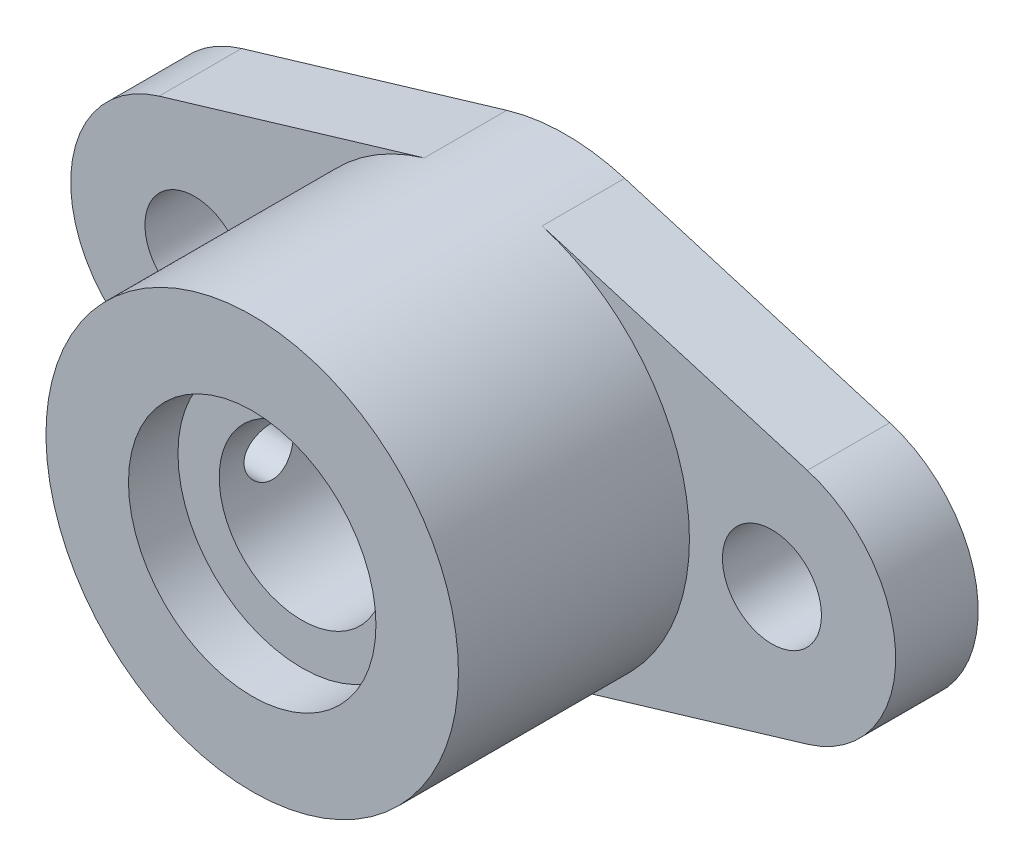
ISO-10303-21;
HEADER;
FILE_DESCRIPTION(('STEP AP214'),'2;1');
FILE_NAME('part.step','',(''),(''),'','','');
FILE_SCHEMA(('AUTOMOTIVE_DESIGN { 1 0 10303 214 1 1 1 1 }'));
ENDSEC;
DATA;
#1=APPLICATION_CONTEXT('core data for automotive mechanical design processes');
#2=APPLICATION_PROTOCOL_DEFINITION('international standard','automotive_design',2000,#1);
#3=PRODUCT_CONTEXT('',#1,'mechanical');
#4=PRODUCT('Part','Part','',(#3));
#5=PRODUCT_RELATED_PRODUCT_CATEGORY('part','',(#4));
#6=PRODUCT_DEFINITION_FORMATION('','',#4);
#7=PRODUCT_DEFINITION_CONTEXT('part definition',#1,'design');
#8=PRODUCT_DEFINITION('design','',#6,#7);
#9=PRODUCT_DEFINITION_SHAPE('','',#8);
#10=(LENGTH_UNIT() NAMED_UNIT(*) SI_UNIT(.MILLI.,.METRE.));
#11=(NAMED_UNIT(*) PLANE_ANGLE_UNIT() SI_UNIT($,.RADIAN.));
#12=(NAMED_UNIT(*) SI_UNIT($,.STERADIAN.) SOLID_ANGLE_UNIT());
#13=UNCERTAINTY_MEASURE_WITH_UNIT(LENGTH_MEASURE(1.E-05),#10,'distance_accuracy_value','');
#14=(GEOMETRIC_REPRESENTATION_CONTEXT(3) GLOBAL_UNCERTAINTY_ASSIGNED_CONTEXT((#13)) GLOBAL_UNIT_ASSIGNED_CONTEXT((#10,
#11,#12)) REPRESENTATION_CONTEXT('',''));
#15=CARTESIAN_POINT('',(0.,0.,0.));
#16=DIRECTION('',(0.,0.,1.));
#17=DIRECTION('',(1.,0.,0.));
#18=AXIS2_PLACEMENT_3D('',#15,#16,#17);
#19=CARTESIAN_POINT('',(0.,0.,38.));
#20=DIRECTION('',(0.,0.,-1.));
#21=DIRECTION('',(-1.,0.,0.));
#22=AXIS2_PLACEMENT_3D('',#19,#20,#21);
#23=CYLINDRICAL_SURFACE('',#22,25.);
#24=CARTESIAN_POINT('',(-25.,0.,29.));
#25=CARTESIAN_POINT('',(-24.9999977357459,-0.167864047107699,28.9999928360586));
#26=CARTESIAN_POINT('',(-24.9982914200408,-0.335834317331191,28.9858633413073));
#27=CARTESIAN_POINT('',(-24.991648705422,-0.667104571308249,28.9297189358446));
#28=CARTESIAN_POINT('',(-24.9867088933728,-0.830399429590068,28.8876745587494));
#29=CARTESIAN_POINT('',(-24.9741559265426,-1.14747479534053,28.776953723474));
#30=CARTESIAN_POINT('',(-24.9665445315309,-1.30126148759225,28.7082947931758));
#31=CARTESIAN_POINT('',(-24.9494959264345,-1.595099157832,28.5463312649167));
#32=CARTESIAN_POINT('',(-24.9400590404141,-1.73515256713516,28.4530310402467));
#33=CARTESIAN_POINT('',(-24.920360105442,-1.99829131534451,28.2439251380248));
#34=CARTESIAN_POINT('',(-24.9100945030904,-2.1212966913072,28.1280191598881));
#35=CARTESIAN_POINT('',(-24.8899239397152,-2.34615931038342,27.8772070351121));
#36=CARTESIAN_POINT('',(-24.8800189967068,-2.44801549826473,27.7422999409814));
#37=CARTESIAN_POINT('',(-24.8616560370405,-2.62798342873896,27.4567991747016));
#38=CARTESIAN_POINT('',(-24.8532025903971,-2.70602075672569,27.3061582754199));
#39=CARTESIAN_POINT('',(-24.8387461344686,-2.83566057301559,26.9937912978913));
#40=CARTESIAN_POINT('',(-24.8327430393798,-2.88726398696776,26.8320656080307));
#41=CARTESIAN_POINT('',(-24.8239006073737,-2.96232930045399,26.5029471406886));
#42=CARTESIAN_POINT('',(-24.8210461452543,-2.98592577987646,26.3355854715723));
#43=CARTESIAN_POINT('',(-24.8187777690611,-3.0047237521967,25.9992550636358));
#44=CARTESIAN_POINT('',(-24.8193637271033,-2.99992630052848,25.830286384783));
#45=CARTESIAN_POINT('',(-24.8238961466306,-2.96218316078668,25.4964740352156));
#46=CARTESIAN_POINT('',(-24.8278249434675,-2.92938543222302,25.3316133613198));
#47=CARTESIAN_POINT('',(-24.8385728087608,-2.83680346170066,25.0097529721786));
#48=CARTESIAN_POINT('',(-24.8453919315688,-2.77701871225814,24.852753404821));
#49=CARTESIAN_POINT('',(-24.8611722079476,-2.63199980699861,24.5506105317609));
#50=CARTESIAN_POINT('',(-24.8701387862198,-2.54670106203924,24.4054985216464));
#51=CARTESIAN_POINT('',(-24.8891993987901,-2.35312173169469,24.1315927890842));
#52=CARTESIAN_POINT('',(-24.8992934806213,-2.24484017723156,24.0027997550974));
#53=CARTESIAN_POINT('',(-24.9195503308637,-2.0075475556218,23.7643289156356));
#54=CARTESIAN_POINT('',(-24.929713127424,-1.87840890051215,23.6547780301429));
#55=CARTESIAN_POINT('',(-24.9489020798549,-1.60350795893872,23.4588884789997));
#56=CARTESIAN_POINT('',(-24.9579282334421,-1.45774563908004,23.3725498599809));
#57=CARTESIAN_POINT('',(-24.9738318861702,-1.15363930826284,23.2255367143603));
#58=CARTESIAN_POINT('',(-24.9807087472809,-0.995291578715588,23.1648698066696));
#59=CARTESIAN_POINT('',(-24.991533065309,-0.670556022273438,23.0710212621491));
#60=CARTESIAN_POINT('',(-24.9954806485584,-0.504168542441621,23.0378384399955));
#61=CARTESIAN_POINT('',(-24.9999852500304,-0.169174396374215,23.0000637445023));
#62=CARTESIAN_POINT('',(-25.0005630093753,-0.000587720432050821,22.9952969675993));
#63=CARTESIAN_POINT('',(-24.9983187823231,0.334982068243261,23.0140285778683));
#64=CARTESIAN_POINT('',(-24.9954968625308,0.50196521232733,23.0375264112954));
#65=CARTESIAN_POINT('',(-24.9867833380686,0.829074263928357,23.1119749640031));
#66=CARTESIAN_POINT('',(-24.9809010237909,0.989219346369035,23.1628426130501));
#67=CARTESIAN_POINT('',(-24.9667255501792,1.29870539768646,23.2905007033536));
#68=CARTESIAN_POINT('',(-24.9584323148759,1.44804602592347,23.3672919614901));
#69=CARTESIAN_POINT('',(-24.9403085158695,1.73246717766504,23.5450429159024));
#70=CARTESIAN_POINT('',(-24.9304708084643,1.86747628962751,23.6461161378108));
#71=CARTESIAN_POINT('',(-24.9103817919419,2.11867625152203,23.8694008464082));
#72=CARTESIAN_POINT('',(-24.9001304677484,2.23486641472949,23.991613104148));
#73=CARTESIAN_POINT('',(-24.8803059484942,2.44574795226153,24.2544756154277));
#74=CARTESIAN_POINT('',(-24.8707365831307,2.54032363231939,24.3952190153439));
#75=CARTESIAN_POINT('',(-24.8534214993383,2.70449314429332,24.6906950250756));
#76=CARTESIAN_POINT('',(-24.8456757467943,2.77408744356074,24.8454273731182));
#77=CARTESIAN_POINT('',(-24.8329105734502,2.88612996668159,25.1641106088947));
#78=CARTESIAN_POINT('',(-24.8278845275633,2.92864420159346,25.3280380118594));
#79=CARTESIAN_POINT('',(-24.8211085274587,2.98553272163516,25.6607689694851));
#80=CARTESIAN_POINT('',(-24.8193584337106,2.99990820526081,25.8295723161573));
#81=CARTESIAN_POINT('',(-24.819336326607,3.0000903381793,26.1661127296372));
#82=CARTESIAN_POINT('',(-24.8210421863943,2.9860787367135,26.3338497257713));
#83=CARTESIAN_POINT('',(-24.8276922947425,2.93026848672089,26.6645667863942));
#84=CARTESIAN_POINT('',(-24.8326365444656,2.88846982822067,26.8275468491756));
#85=CARTESIAN_POINT('',(-24.8451996524586,2.77832739820545,27.1441045388887));
#86=CARTESIAN_POINT('',(-24.8528177016812,2.70999165570539,27.2976849934955));
#87=CARTESIAN_POINT('',(-24.8698714539139,2.54873282628009,27.5912277470701));
#88=CARTESIAN_POINT('',(-24.8793071726153,2.45580952709445,27.7311899284593));
#89=CARTESIAN_POINT('',(-24.8990055122588,2.24733689647205,27.9944529401088));
#90=CARTESIAN_POINT('',(-24.9092728581347,2.1316520393015,28.1176461032663));
#91=CARTESIAN_POINT('',(-24.9294354968169,1.88122093334447,28.342942479566));
#92=CARTESIAN_POINT('',(-24.939330701051,1.74647018263601,28.4450406976292));
#93=CARTESIAN_POINT('',(-24.9576721709324,1.46119322465137,28.6255505779989));
#94=CARTESIAN_POINT('',(-24.966113221621,1.31061323462417,28.7038777257223));
#95=CARTESIAN_POINT('',(-24.9805418519727,0.998422751685309,28.8340237644426));
#96=CARTESIAN_POINT('',(-24.9865321180615,0.836824564362142,28.8858716961804));
#97=CARTESIAN_POINT('',(-24.9939268325999,0.561977101236696,28.9490634203381));
#98=CARTESIAN_POINT('',(-24.996193279433,0.450466569753487,28.9681374838864));
#99=CARTESIAN_POINT('',(-24.9992306204204,0.225986735693695,28.993608143491));
#100=CARTESIAN_POINT('',(-25.0000015244492,0.113017442753626,29.0000048232504));
#101=CARTESIAN_POINT('',(-25.,0.,29.));
#102=B_SPLINE_CURVE_WITH_KNOTS('',3,(#24,#25,#26,#27,#28,#29,#30,#31,#32,#33,#34,#35,#36,#37,
#38,#39,#40,#41,#42,#43,#44,#45,#46,#47,#48,#49,#50,#51,#52,#53,#54,#55,#56,#57,#58,#59,#60,#61,
#62,#63,#64,#65,#66,#67,#68,#69,#70,#71,#72,#73,#74,#75,#76,#77,#78,#79,#80,#81,#82,#83,#84,#85,
#86,#87,#88,#89,#90,#91,#92,#93,#94,#95,#96,#97,#98,#99,#100,#101),.UNSPECIFIED.,.T.,.F.,(4,2,2,
2,2,2,2,2,2,2,2,2,2,2,2,2,2,2,2,2,2,2,2,2,2,2,2,2,2,2,2,2,2,2,2,2,2,2,4),(0.,0.50317935095616,
1.00689069408623,1.5102708637556,2.01356175441693,2.51913872195878,3.02474090904883,
3.53190689496397,4.03905511999113,4.54375638343278,5.04843888668479,5.55047092912253,
6.05251241253396,6.55583573710536,7.05918028869262,7.56572944640317,8.07227962172601,
8.57898002694278,9.08565857822619,9.58921522624225,10.0927620090108,10.5947890255775,
11.0968318630167,11.6012692178556,12.1057249760356,12.6128207581672,13.119907053063,
13.6257524826489,14.1315763666154,14.6341719319229,15.1367676776234,15.6392114771388,
16.1416596143121,16.6471952402032,17.1528504352009,17.6602829023946,18.1671576479275,
18.5059342945627,18.8447087043981),.UNSPECIFIED.);
#103=CARTESIAN_POINT('',(-25.,0.,29.));
#104=VERTEX_POINT('',#103);
#105=EDGE_CURVE('E253',#104,#104,#102,.T.);
#106=ORIENTED_EDGE('',*,*,#105,.T.);
#107=EDGE_LOOP('',(#106));
#108=FACE_BOUND('',#107,.T.);
#109=CARTESIAN_POINT('',(0.,0.,38.));
#110=DIRECTION('',(0.,0.,1.));
#111=DIRECTION('',(1.,0.,0.));
#112=AXIS2_PLACEMENT_3D('',#109,#110,#111);
#113=CIRCLE('',#112,25.);
#114=CARTESIAN_POINT('',(25.,0.,38.));
#115=VERTEX_POINT('',#114);
#116=EDGE_CURVE('E146',#115,#115,#113,.T.);
#117=ORIENTED_EDGE('',*,*,#116,.F.);
#118=EDGE_LOOP('',(#117));
#119=FACE_BOUND('',#118,.T.);
#120=DIRECTION('',(0.,0.,-1.));
#121=VECTOR('',#120,1.);
#122=CARTESIAN_POINT('',(7.14285714285714,-23.9578711874977,10.));
#123=LINE('',#122,#121);
#124=CARTESIAN_POINT('',(7.14285714285714,-23.9578711874977,10.));
#125=VERTEX_POINT('',#124);
#126=CARTESIAN_POINT('',(7.14285714285715,-23.9578711874977,0.));
#127=VERTEX_POINT('',#126);
#128=EDGE_CURVE('E68',#125,#127,#123,.T.);
#129=ORIENTED_EDGE('',*,*,#128,.F.);
#130=CARTESIAN_POINT('',(0.,0.,10.));
#131=DIRECTION('',(0.,0.,1.));
#132=DIRECTION('',(1.,0.,0.));
#133=AXIS2_PLACEMENT_3D('',#130,#131,#132);
#134=CIRCLE('',#133,25.);
#135=CARTESIAN_POINT('',(7.14285714285715,23.9578711874977,10.));
#136=VERTEX_POINT('',#135);
#137=EDGE_CURVE('E63',#125,#136,#134,.T.);
#138=ORIENTED_EDGE('',*,*,#137,.T.);
#139=DIRECTION('',(0.,0.,-1.));
#140=VECTOR('',#139,1.);
#141=CARTESIAN_POINT('',(7.14285714285714,23.9578711874977,10.));
#142=LINE('',#141,#140);
#143=CARTESIAN_POINT('',(7.14285714285714,23.9578711874977,0.));
#144=VERTEX_POINT('',#143);
#145=EDGE_CURVE('E142',#136,#144,#142,.T.);
#146=ORIENTED_EDGE('',*,*,#145,.T.);
#147=CARTESIAN_POINT('',(0.,0.,0.));
#148=DIRECTION('',(0.,0.,1.));
#149=DIRECTION('',(1.,0.,0.));
#150=AXIS2_PLACEMENT_3D('',#147,#148,#149);
#151=CIRCLE('',#150,25.);
#152=CARTESIAN_POINT('',(-7.14285714285714,23.9578711874977,0.));
#153=VERTEX_POINT('',#152);
#154=EDGE_CURVE('E136',#144,#153,#151,.T.);
#155=ORIENTED_EDGE('',*,*,#154,.T.);
#156=DIRECTION('',(0.,0.,-1.));
#157=VECTOR('',#156,1.);
#158=CARTESIAN_POINT('',(-7.14285714285715,23.9578711874977,10.));
#159=LINE('',#158,#157);
#160=CARTESIAN_POINT('',(-7.14285714285714,23.9578711874977,10.));
#161=VERTEX_POINT('',#160);
#162=EDGE_CURVE('E172',#161,#153,#159,.T.);
#163=ORIENTED_EDGE('',*,*,#162,.F.);
#164=CARTESIAN_POINT('',(0.,0.,10.));
#165=DIRECTION('',(0.,0.,1.));
#166=DIRECTION('',(1.,0.,0.));
#167=AXIS2_PLACEMENT_3D('',#164,#165,#166);
#168=CIRCLE('',#167,25.);
#169=CARTESIAN_POINT('',(-7.14285714285714,-23.9578711874977,10.));
#170=VERTEX_POINT('',#169);
#171=EDGE_CURVE('E169',#161,#170,#168,.T.);
#172=ORIENTED_EDGE('',*,*,#171,.T.);
#173=DIRECTION('',(0.,0.,-1.));
#174=VECTOR('',#173,1.);
#175=CARTESIAN_POINT('',(-7.14285714285714,-23.9578711874977,10.));
#176=LINE('',#175,#174);
#177=CARTESIAN_POINT('',(-7.14285714285714,-23.9578711874977,0.));
#178=VERTEX_POINT('',#177);
#179=EDGE_CURVE('E190',#170,#178,#176,.T.);
#180=ORIENTED_EDGE('',*,*,#179,.T.);
#181=EDGE_CURVE('E140',#178,#127,#151,.T.);
#182=ORIENTED_EDGE('',*,*,#181,.T.);
#183=EDGE_LOOP('',(#129,#138,#146,#155,#163,#172,#180,#182));
#184=FACE_BOUND('',#183,.T.);
#185=ADVANCED_FACE('F41',(#108,#119,#184),#23,.T.);
#186=CARTESIAN_POINT('',(-7.14285714285714,23.9578711874977,10.));
#187=DIRECTION('',(-0.285714285714286,0.95831484749991,0.));
#188=DIRECTION('',(-0.95831484749991,-0.285714285714286,0.));
#189=AXIS2_PLACEMENT_3D('',#186,#187,#188);
#190=PLANE('',#189);
#191=DIRECTION('',(0.95831484749991,0.285714285714286,0.));
#192=VECTOR('',#191,1.);
#193=CARTESIAN_POINT('',(-7.14285714285714,23.9578711874977,0.));
#194=LINE('',#193,#192);
#195=CARTESIAN_POINT('',(-39.2857142857143,14.3747227124986,0.));
#196=VERTEX_POINT('',#195);
#197=EDGE_CURVE('E176',#196,#153,#194,.T.);
#198=ORIENTED_EDGE('',*,*,#197,.F.);
#199=DIRECTION('',(0.,0.,-1.));
#200=VECTOR('',#199,1.);
#201=CARTESIAN_POINT('',(-39.2857142857143,14.3747227124986,10.));
#202=LINE('',#201,#200);
#203=CARTESIAN_POINT('',(-39.2857142857143,14.3747227124986,10.));
#204=VERTEX_POINT('',#203);
#205=EDGE_CURVE('E11',#204,#196,#202,.T.);
#206=ORIENTED_EDGE('',*,*,#205,.F.);
#207=DIRECTION('',(0.95831484749991,0.285714285714286,0.));
#208=VECTOR('',#207,1.);
#209=CARTESIAN_POINT('',(-7.14285714285714,23.9578711874977,10.));
#210=LINE('',#209,#208);
#211=EDGE_CURVE('E156',#204,#161,#210,.T.);
#212=ORIENTED_EDGE('',*,*,#211,.T.);
#213=ORIENTED_EDGE('',*,*,#162,.T.);
#214=EDGE_LOOP('',(#198,#206,#212,#213));
#215=FACE_BOUND('',#214,.T.);
#216=ADVANCED_FACE('F209',(#215),#190,.T.);
#217=CARTESIAN_POINT('',(-35.,0.,10.));
#218=DIRECTION('',(0.,0.,-1.));
#219=DIRECTION('',(-1.,0.,0.));
#220=AXIS2_PLACEMENT_3D('',#217,#218,#219);
#221=CYLINDRICAL_SURFACE('',#220,15.);
#222=CARTESIAN_POINT('',(-35.,0.,0.));
#223=DIRECTION('',(0.,0.,1.));
#224=DIRECTION('',(1.,0.,0.));
#225=AXIS2_PLACEMENT_3D('',#222,#223,#224);
#226=CIRCLE('',#225,15.);
#227=CARTESIAN_POINT('',(-39.2857142857143,-14.3747227124986,0.));
#228=VERTEX_POINT('',#227);
#229=EDGE_CURVE('E180',#196,#228,#226,.T.);
#230=ORIENTED_EDGE('',*,*,#229,.T.);
#231=DIRECTION('',(0.,0.,-1.));
#232=VECTOR('',#231,1.);
#233=CARTESIAN_POINT('',(-39.2857142857143,-14.3747227124986,10.));
#234=LINE('',#233,#232);
#235=CARTESIAN_POINT('',(-39.2857142857143,-14.3747227124986,10.));
#236=VERTEX_POINT('',#235);
#237=EDGE_CURVE('E56',#236,#228,#234,.T.);
#238=ORIENTED_EDGE('',*,*,#237,.F.);
#239=CARTESIAN_POINT('',(-35.,0.,10.));
#240=DIRECTION('',(0.,0.,1.));
#241=DIRECTION('',(1.,0.,0.));
#242=AXIS2_PLACEMENT_3D('',#239,#240,#241);
#243=CIRCLE('',#242,15.);
#244=EDGE_CURVE('E161',#204,#236,#243,.T.);
#245=ORIENTED_EDGE('',*,*,#244,.F.);
#246=ORIENTED_EDGE('',*,*,#205,.T.);
#247=EDGE_LOOP('',(#230,#238,#245,#246));
#248=FACE_BOUND('',#247,.T.);
#249=ADVANCED_FACE('F203',(#248),#221,.T.);
#250=CARTESIAN_POINT('',(-7.14285714285714,-23.9578711874977,10.));
#251=DIRECTION('',(0.285714285714286,0.95831484749991,0.));
#252=DIRECTION('',(-0.95831484749991,0.285714285714286,0.));
#253=AXIS2_PLACEMENT_3D('',#250,#251,#252);
#254=PLANE('',#253);
#255=DIRECTION('',(0.95831484749991,-0.285714285714286,0.));
#256=VECTOR('',#255,1.);
#257=CARTESIAN_POINT('',(-7.14285714285714,-23.9578711874977,0.));
#258=LINE('',#257,#256);
#259=EDGE_CURVE('E157',#228,#178,#258,.T.);
#260=ORIENTED_EDGE('',*,*,#259,.T.);
#261=ORIENTED_EDGE('',*,*,#179,.F.);
#262=DIRECTION('',(0.95831484749991,-0.285714285714286,0.));
#263=VECTOR('',#262,1.);
#264=CARTESIAN_POINT('',(-7.14285714285714,-23.9578711874977,10.));
#265=LINE('',#264,#263);
#266=EDGE_CURVE('E165',#236,#170,#265,.T.);
#267=ORIENTED_EDGE('',*,*,#266,.F.);
#268=ORIENTED_EDGE('',*,*,#237,.T.);
#269=EDGE_LOOP('',(#260,#261,#267,#268));
#270=FACE_BOUND('',#269,.T.);
#271=ADVANCED_FACE('F198',(#270),#254,.F.);
#272=CARTESIAN_POINT('',(-35.,0.,10.));
#273=DIRECTION('',(0.,0.,-1.));
#274=DIRECTION('',(-1.,0.,0.));
#275=AXIS2_PLACEMENT_3D('',#272,#273,#274);
#276=CYLINDRICAL_SURFACE('',#275,5.99999999999999);
#277=CARTESIAN_POINT('',(-35.,0.,10.));
#278=DIRECTION('',(0.,0.,1.));
#279=DIRECTION('',(1.,0.,0.));
#280=AXIS2_PLACEMENT_3D('',#277,#278,#279);
#281=CIRCLE('',#280,5.99999999999999);
#282=CARTESIAN_POINT('',(-29.,0.,10.));
#283=VERTEX_POINT('',#282);
#284=EDGE_CURVE('E152',#283,#283,#281,.T.);
#285=ORIENTED_EDGE('',*,*,#284,.T.);
#286=EDGE_LOOP('',(#285));
#287=FACE_BOUND('',#286,.T.);
#288=CARTESIAN_POINT('',(-35.,0.,0.));
#289=DIRECTION('',(0.,0.,1.));
#290=DIRECTION('',(1.,0.,0.));
#291=AXIS2_PLACEMENT_3D('',#288,#289,#290);
#292=CIRCLE('',#291,5.99999999999999);
#293=CARTESIAN_POINT('',(-29.,0.,0.));
#294=VERTEX_POINT('',#293);
#295=EDGE_CURVE('E149',#294,#294,#292,.T.);
#296=ORIENTED_EDGE('',*,*,#295,.F.);
#297=EDGE_LOOP('',(#296));
#298=FACE_BOUND('',#297,.T.);
#299=ADVANCED_FACE('F43',(#287,#298),#276,.F.);
#300=CARTESIAN_POINT('',(0.,0.,10.));
#301=DIRECTION('',(0.,0.,1.));
#302=DIRECTION('',(1.,0.,0.));
#303=AXIS2_PLACEMENT_3D('',#300,#301,#302);
#304=PLANE('',#303);
#305=ORIENTED_EDGE('',*,*,#284,.F.);
#306=EDGE_LOOP('',(#305));
#307=FACE_BOUND('',#306,.T.);
#308=ORIENTED_EDGE('',*,*,#211,.F.);
#309=ORIENTED_EDGE('',*,*,#244,.T.);
#310=ORIENTED_EDGE('',*,*,#266,.T.);
#311=ORIENTED_EDGE('',*,*,#171,.F.);
#312=EDGE_LOOP('',(#308,#309,#310,#311));
#313=FACE_BOUND('',#312,.T.);
#314=ADVANCED_FACE('F284',(#307,#313),#304,.T.);
#315=CARTESIAN_POINT('',(0.,0.,0.));
#316=DIRECTION('',(0.,0.,1.));
#317=DIRECTION('',(1.,0.,0.));
#318=AXIS2_PLACEMENT_3D('',#315,#316,#317);
#319=PLANE('',#318);
#320=CARTESIAN_POINT('',(0.,0.,0.));
#321=DIRECTION('',(0.,0.,1.));
#322=DIRECTION('',(1.,0.,0.));
#323=AXIS2_PLACEMENT_3D('',#320,#321,#322);
#324=CIRCLE('',#323,9.99999999999999);
#325=CARTESIAN_POINT('',(9.99999999999999,0.,0.));
#326=VERTEX_POINT('',#325);
#327=EDGE_CURVE('E236',#326,#326,#324,.T.);
#328=ORIENTED_EDGE('',*,*,#327,.T.);
#329=EDGE_LOOP('',(#328));
#330=FACE_BOUND('',#329,.T.);
#331=ORIENTED_EDGE('',*,*,#295,.T.);
#332=EDGE_LOOP('',(#331));
#333=FACE_BOUND('',#332,.T.);
#334=ORIENTED_EDGE('',*,*,#197,.T.);
#335=ORIENTED_EDGE('',*,*,#154,.F.);
#336=DIRECTION('',(0.95831484749991,-0.285714285714286,0.));
#337=VECTOR('',#336,1.);
#338=CARTESIAN_POINT('',(7.14285714285715,23.9578711874977,0.));
#339=LINE('',#338,#337);
#340=CARTESIAN_POINT('',(39.2857142857143,14.3747227124986,0.));
#341=VERTEX_POINT('',#340);
#342=EDGE_CURVE('E214',#144,#341,#339,.T.);
#343=ORIENTED_EDGE('',*,*,#342,.T.);
#344=CARTESIAN_POINT('',(35.,0.,0.));
#345=DIRECTION('',(0.,0.,1.));
#346=DIRECTION('',(1.,0.,0.));
#347=AXIS2_PLACEMENT_3D('',#344,#345,#346);
#348=CIRCLE('',#347,15.);
#349=CARTESIAN_POINT('',(39.2857142857143,-14.3747227124986,0.));
#350=VERTEX_POINT('',#349);
#351=EDGE_CURVE('E215',#350,#341,#348,.T.);
#352=ORIENTED_EDGE('',*,*,#351,.F.);
#353=DIRECTION('',(0.95831484749991,0.285714285714286,0.));
#354=VECTOR('',#353,1.);
#355=CARTESIAN_POINT('',(7.14285714285714,-23.9578711874977,0.));
#356=LINE('',#355,#354);
#357=EDGE_CURVE('E134',#127,#350,#356,.T.);
#358=ORIENTED_EDGE('',*,*,#357,.F.);
#359=ORIENTED_EDGE('',*,*,#181,.F.);
#360=ORIENTED_EDGE('',*,*,#259,.F.);
#361=ORIENTED_EDGE('',*,*,#229,.F.);
#362=EDGE_LOOP('',(#334,#335,#343,#352,#358,#359,#360,#361));
#363=FACE_BOUND('',#362,.T.);
#364=CARTESIAN_POINT('',(35.,0.,0.));
#365=DIRECTION('',(0.,0.,1.));
#366=DIRECTION('',(1.,0.,0.));
#367=AXIS2_PLACEMENT_3D('',#364,#365,#366);
#368=CIRCLE('',#367,5.99999999999999);
#369=CARTESIAN_POINT('',(41.,0.,0.));
#370=VERTEX_POINT('',#369);
#371=EDGE_CURVE('E233',#370,#370,#368,.T.);
#372=ORIENTED_EDGE('',*,*,#371,.T.);
#373=EDGE_LOOP('',(#372));
#374=FACE_BOUND('',#373,.T.);
#375=ADVANCED_FACE('F206',(#330,#333,#363,#374),#319,.F.);
#376=CARTESIAN_POINT('',(0.,0.,38.));
#377=DIRECTION('',(0.,0.,1.));
#378=DIRECTION('',(1.,0.,0.));
#379=AXIS2_PLACEMENT_3D('',#376,#377,#378);
#380=PLANE('',#379);
#381=CARTESIAN_POINT('',(0.,0.,38.));
#382=DIRECTION('',(0.,0.,1.));
#383=DIRECTION('',(1.,0.,0.));
#384=AXIS2_PLACEMENT_3D('',#381,#382,#383);
#385=CIRCLE('',#384,15.);
#386=CARTESIAN_POINT('',(15.,0.,38.));
#387=VERTEX_POINT('',#386);
#388=EDGE_CURVE('E249',#387,#387,#385,.T.);
#389=ORIENTED_EDGE('',*,*,#388,.F.);
#390=EDGE_LOOP('',(#389));
#391=FACE_BOUND('',#390,.T.);
#392=ORIENTED_EDGE('',*,*,#116,.T.);
#393=EDGE_LOOP('',(#392));
#394=FACE_BOUND('',#393,.T.);
#395=ADVANCED_FACE('F275',(#391,#394),#380,.T.);
#396=CARTESIAN_POINT('',(7.14285714285714,-23.9578711874977,10.));
#397=DIRECTION('',(-0.285714285714286,0.95831484749991,0.));
#398=DIRECTION('',(-0.95831484749991,-0.285714285714286,0.));
#399=AXIS2_PLACEMENT_3D('',#396,#397,#398);
#400=PLANE('',#399);
#401=ORIENTED_EDGE('',*,*,#357,.T.);
#402=DIRECTION('',(0.,0.,-1.));
#403=VECTOR('',#402,1.);
#404=CARTESIAN_POINT('',(39.2857142857143,-14.3747227124986,10.));
#405=LINE('',#404,#403);
#406=CARTESIAN_POINT('',(39.2857142857143,-14.3747227124986,10.));
#407=VERTEX_POINT('',#406);
#408=EDGE_CURVE('E117',#407,#350,#405,.T.);
#409=ORIENTED_EDGE('',*,*,#408,.F.);
#410=DIRECTION('',(0.95831484749991,0.285714285714286,0.));
#411=VECTOR('',#410,1.);
#412=CARTESIAN_POINT('',(7.14285714285714,-23.9578711874977,10.));
#413=LINE('',#412,#411);
#414=EDGE_CURVE('E125',#125,#407,#413,.T.);
#415=ORIENTED_EDGE('',*,*,#414,.F.);
#416=ORIENTED_EDGE('',*,*,#128,.T.);
#417=EDGE_LOOP('',(#401,#409,#415,#416));
#418=FACE_BOUND('',#417,.T.);
#419=ADVANCED_FACE('F132',(#418),#400,.F.);
#420=CARTESIAN_POINT('',(35.,0.,10.));
#421=DIRECTION('',(0.,0.,-1.));
#422=DIRECTION('',(-1.,0.,0.));
#423=AXIS2_PLACEMENT_3D('',#420,#421,#422);
#424=CYLINDRICAL_SURFACE('',#423,15.);
#425=ORIENTED_EDGE('',*,*,#351,.T.);
#426=DIRECTION('',(0.,0.,-1.));
#427=VECTOR('',#426,1.);
#428=CARTESIAN_POINT('',(39.2857142857143,14.3747227124986,10.));
#429=LINE('',#428,#427);
#430=CARTESIAN_POINT('',(39.2857142857143,14.3747227124986,10.));
#431=VERTEX_POINT('',#430);
#432=EDGE_CURVE('E119',#431,#341,#429,.T.);
#433=ORIENTED_EDGE('',*,*,#432,.F.);
#434=CARTESIAN_POINT('',(35.,0.,10.));
#435=DIRECTION('',(0.,0.,1.));
#436=DIRECTION('',(1.,0.,0.));
#437=AXIS2_PLACEMENT_3D('',#434,#435,#436);
#438=CIRCLE('',#437,15.);
#439=EDGE_CURVE('E112',#407,#431,#438,.T.);
#440=ORIENTED_EDGE('',*,*,#439,.F.);
#441=ORIENTED_EDGE('',*,*,#408,.T.);
#442=EDGE_LOOP('',(#425,#433,#440,#441));
#443=FACE_BOUND('',#442,.T.);
#444=ADVANCED_FACE('F115',(#443),#424,.T.);
#445=CARTESIAN_POINT('',(7.14285714285715,23.9578711874977,10.));
#446=DIRECTION('',(0.285714285714286,0.95831484749991,0.));
#447=DIRECTION('',(-0.95831484749991,0.285714285714286,0.));
#448=AXIS2_PLACEMENT_3D('',#445,#446,#447);
#449=PLANE('',#448);
#450=ORIENTED_EDGE('',*,*,#342,.F.);
#451=ORIENTED_EDGE('',*,*,#145,.F.);
#452=DIRECTION('',(0.95831484749991,-0.285714285714286,0.));
#453=VECTOR('',#452,1.);
#454=CARTESIAN_POINT('',(7.14285714285715,23.9578711874977,10.));
#455=LINE('',#454,#453);
#456=EDGE_CURVE('E124',#136,#431,#455,.T.);
#457=ORIENTED_EDGE('',*,*,#456,.T.);
#458=ORIENTED_EDGE('',*,*,#432,.T.);
#459=EDGE_LOOP('',(#450,#451,#457,#458));
#460=FACE_BOUND('',#459,.T.);
#461=ADVANCED_FACE('F310',(#460),#449,.T.);
#462=CARTESIAN_POINT('',(35.,0.,10.));
#463=DIRECTION('',(0.,0.,-1.));
#464=DIRECTION('',(-1.,0.,0.));
#465=AXIS2_PLACEMENT_3D('',#462,#463,#464);
#466=CYLINDRICAL_SURFACE('',#465,5.99999999999999);
#467=CARTESIAN_POINT('',(35.,0.,10.));
#468=DIRECTION('',(0.,0.,1.));
#469=DIRECTION('',(1.,0.,0.));
#470=AXIS2_PLACEMENT_3D('',#467,#468,#469);
#471=CIRCLE('',#470,5.99999999999999);
#472=CARTESIAN_POINT('',(41.,0.,10.));
#473=VERTEX_POINT('',#472);
#474=EDGE_CURVE('E130',#473,#473,#471,.T.);
#475=ORIENTED_EDGE('',*,*,#474,.T.);
#476=EDGE_LOOP('',(#475));
#477=FACE_BOUND('',#476,.T.);
#478=ORIENTED_EDGE('',*,*,#371,.F.);
#479=EDGE_LOOP('',(#478));
#480=FACE_BOUND('',#479,.T.);
#481=ADVANCED_FACE('F289',(#477,#480),#466,.F.);
#482=CARTESIAN_POINT('',(0.,0.,10.));
#483=DIRECTION('',(0.,0.,1.));
#484=DIRECTION('',(1.,0.,0.));
#485=AXIS2_PLACEMENT_3D('',#482,#483,#484);
#486=PLANE('',#485);
#487=ORIENTED_EDGE('',*,*,#474,.F.);
#488=EDGE_LOOP('',(#487));
#489=FACE_BOUND('',#488,.T.);
#490=ORIENTED_EDGE('',*,*,#414,.T.);
#491=ORIENTED_EDGE('',*,*,#439,.T.);
#492=ORIENTED_EDGE('',*,*,#456,.F.);
#493=ORIENTED_EDGE('',*,*,#137,.F.);
#494=EDGE_LOOP('',(#490,#491,#492,#493));
#495=FACE_BOUND('',#494,.T.);
#496=ADVANCED_FACE('F127',(#489,#495),#486,.T.);
#497=CARTESIAN_POINT('',(0.,0.,38.));
#498=DIRECTION('',(0.,0.,1.));
#499=DIRECTION('',(1.,0.,0.));
#500=AXIS2_PLACEMENT_3D('',#497,#498,#499);
#501=CYLINDRICAL_SURFACE('',#500,10.);
#502=CARTESIAN_POINT('',(-10.,0.,23.));
#503=CARTESIAN_POINT('',(-9.999998585011,-0.1645772255066,23.0000019949698));
#504=CARTESIAN_POINT('',(-9.99589831387907,-0.329174636703058,23.0135877272479));
#505=CARTESIAN_POINT('',(-9.97994211187381,-0.653576250609761,23.0674427084442));
#506=CARTESIAN_POINT('',(-9.96808386779384,-0.813379008822839,23.1077199160467));
#507=CARTESIAN_POINT('',(-9.93791105003673,-1.12346541550905,23.2134920338205));
#508=CARTESIAN_POINT('',(-9.91960600500851,-1.27376272879075,23.2789497392379));
#509=CARTESIAN_POINT('',(-9.8784421847529,-1.56124836210626,23.4330721861117));
#510=CARTESIAN_POINT('',(-9.85558280384133,-1.69843493493934,23.5217400147908));
#511=CARTESIAN_POINT('',(-9.80701474385548,-1.95974359436749,23.7224480149453));
#512=CARTESIAN_POINT('',(-9.78124767314073,-2.08343614248868,23.8350332517718));
#513=CARTESIAN_POINT('',(-9.73011668420884,-2.31049841846647,24.0792184598204));
#514=CARTESIAN_POINT('',(-9.70475283449003,-2.41386472654881,24.2108216242499));
#515=CARTESIAN_POINT('',(-9.65668227987544,-2.59960075447415,24.4929415060752));
#516=CARTESIAN_POINT('',(-9.63404813327749,-2.68144618044427,24.6438169219815));
#517=CARTESIAN_POINT('',(-9.59487240788062,-2.8184278954952,24.9579785084606));
#518=CARTESIAN_POINT('',(-9.57832936626621,-2.87357059839946,25.1212616878559));
#519=CARTESIAN_POINT('',(-9.55381741676868,-2.95403267365303,25.4507805322609));
#520=CARTESIAN_POINT('',(-9.54562138649067,-2.98014392469354,25.6168054877279));
#521=CARTESIAN_POINT('',(-9.53805579499534,-3.00427461229344,25.9510663124335));
#522=CARTESIAN_POINT('',(-9.53868409521142,-3.00230085522156,26.1193016361182));
#523=CARTESIAN_POINT('',(-9.54849488135555,-2.97093954399623,26.446767817217));
#524=CARTESIAN_POINT('',(-9.55736777198281,-2.9425441052537,26.6061045007245));
#525=CARTESIAN_POINT('',(-9.58216712457248,-2.86074840854111,26.9176395725469));
#526=CARTESIAN_POINT('',(-9.59809428264701,-2.80734568283281,27.0698372547487));
#527=CARTESIAN_POINT('',(-9.63545466149946,-2.67632053307363,27.3652006993215));
#528=CARTESIAN_POINT('',(-9.65696032231904,-2.59837633869285,27.5082141679105));
#529=CARTESIAN_POINT('',(-9.70301974000129,-2.42070445177366,27.7794640440204));
#530=CARTESIAN_POINT('',(-9.72757423493982,-2.32097148005176,27.9076968588276));
#531=CARTESIAN_POINT('',(-9.77822022595875,-2.09762581531092,28.151372381524));
#532=CARTESIAN_POINT('',(-9.80433308620996,-1.97318981493394,28.2660573280593));
#533=CARTESIAN_POINT('',(-9.85424488126517,-1.70652651862793,28.4731079681285));
#534=CARTESIAN_POINT('',(-9.8780436703682,-1.56429810372177,28.5654722568289));
#535=CARTESIAN_POINT('',(-9.92086320138941,-1.2647100766856,28.7257198449295));
#536=CARTESIAN_POINT('',(-9.93985087336628,-1.1072554994959,28.7934350324997));
#537=CARTESIAN_POINT('',(-9.97067043664444,-0.782490831207036,28.9011991801993));
#538=CARTESIAN_POINT('',(-9.98250432373999,-0.615183503179161,28.941255857065));
#539=CARTESIAN_POINT('',(-9.99736729287077,-0.281904485336662,28.9913043557988));
#540=CARTESIAN_POINT('',(-10.0006970083558,-0.116100195202373,29.0023231716032));
#541=CARTESIAN_POINT('',(-9.99905846483519,0.214999211646766,28.9968616885758));
#542=CARTESIAN_POINT('',(-9.99409131355514,0.380294393381561,28.9803850606971));
#543=CARTESIAN_POINT('',(-9.97661393974324,0.701807210619393,28.921230777777));
#544=CARTESIAN_POINT('',(-9.96427659598828,0.858145545228337,28.8791532248383));
#545=CARTESIAN_POINT('',(-9.9334869568307,1.16150927790904,28.7707135344436));
#546=CARTESIAN_POINT('',(-9.91503392642187,1.30853355405117,28.7043484779243));
#547=CARTESIAN_POINT('',(-9.87339308702631,1.5928743789221,28.5474936690377));
#548=CARTESIAN_POINT('',(-9.8501056165928,1.72988765239933,28.456481318104));
#549=CARTESIAN_POINT('',(-9.80146937528704,1.9870466159603,28.2535504918944));
#550=CARTESIAN_POINT('',(-9.77612008862419,2.10718806471188,28.1416267762247));
#551=CARTESIAN_POINT('',(-9.72506343738006,2.33171489102052,27.8952253832613));
#552=CARTESIAN_POINT('',(-9.69937650065513,2.43536962463001,27.7600762484563));
#553=CARTESIAN_POINT('',(-9.65153030477949,2.61857990144312,27.4737441219731));
#554=CARTESIAN_POINT('',(-9.62937095313121,2.69813607658965,27.3225615508842));
#555=CARTESIAN_POINT('',(-9.5913437922631,2.83034694254315,27.00893501749));
#556=CARTESIAN_POINT('',(-9.575446756735,2.88312693874021,26.8465476269243));
#557=CARTESIAN_POINT('',(-9.55183188739737,2.96043461630306,26.5146240621395));
#558=CARTESIAN_POINT('',(-9.54411125069387,2.98497197957848,26.3450903584339));
#559=CARTESIAN_POINT('',(-9.53799944941558,3.0044396896993,26.0112769632232));
#560=CARTESIAN_POINT('',(-9.53923294700395,3.00056110615887,25.8470726979012));
#561=CARTESIAN_POINT('',(-9.54998802392188,2.9661501088861,25.5217717931988));
#562=CARTESIAN_POINT('',(-9.55950927135901,2.93561876249407,25.360675029639));
#563=CARTESIAN_POINT('',(-9.58551527389243,2.84953777608686,25.0481092017367));
#564=CARTESIAN_POINT('',(-9.60191209104934,2.79430351014248,24.8965454252826));
#565=CARTESIAN_POINT('',(-9.63980557805265,2.66063014242147,24.6047151223586));
#566=CARTESIAN_POINT('',(-9.6613032238508,2.58218659925722,24.4644507647169));
#567=CARTESIAN_POINT('',(-9.70795352855338,2.40097527610175,24.1936737669475));
#568=CARTESIAN_POINT('',(-9.7332108032858,2.29742552185996,24.0637024774796));
#569=CARTESIAN_POINT('',(-9.78402640899066,2.07034869259555,23.8225950033838));
#570=CARTESIAN_POINT('',(-9.80958481647543,1.94681643426897,23.7114637210644));
#571=CARTESIAN_POINT('',(-9.85901873141573,1.67893152436652,23.5079531754101));
#572=CARTESIAN_POINT('',(-9.88282319531421,1.53407577158122,23.4162171062891));
#573=CARTESIAN_POINT('',(-9.92521360911553,1.23028274796705,23.2585296601919));
#574=CARTESIAN_POINT('',(-9.94380199862114,1.07135210599791,23.192566223451));
#575=CARTESIAN_POINT('',(-9.97204349938618,0.761515425310562,23.0942094486945));
#576=CARTESIAN_POINT('',(-9.98244054762139,0.611573923908468,23.0589766542335));
#577=CARTESIAN_POINT('',(-9.9964188898898,0.307760390461559,23.0118729495168));
#578=CARTESIAN_POINT('',(-10.0000013230948,0.153889019716279,22.9999981345904));
#579=CARTESIAN_POINT('',(-10.,0.,23.));
#580=B_SPLINE_CURVE_WITH_KNOTS('',3,(#502,#503,#504,#505,#506,#507,#508,#509,#510,#511,#512,
#513,#514,#515,#516,#517,#518,#519,#520,#521,#522,#523,#524,#525,#526,#527,#528,#529,#530,#531,
#532,#533,#534,#535,#536,#537,#538,#539,#540,#541,#542,#543,#544,#545,#546,#547,#548,#549,#550,
#551,#552,#553,#554,#555,#556,#557,#558,#559,#560,#561,#562,#563,#564,#565,#566,#567,#568,#569,
#570,#571,#572,#573,#574,#575,#576,#577,#578,#579),.UNSPECIFIED.,.T.,.F.,(4,2,2,2,2,2,2,2,2,2,2,
2,2,2,2,2,2,2,2,2,2,2,2,2,2,2,2,2,2,2,2,2,2,2,2,2,2,2,4),(0.,0.493166407225221,
0.986479929691998,1.47906735260175,1.9717203288254,2.47711205896383,2.98258874577266,
3.49942962008218,4.01614629086447,4.51839378713197,5.02051956638178,5.50452033395352,
5.98856887316002,6.47924852894238,6.9700472031711,7.48134208096333,7.99266913062142,
8.50742093763376,9.02202907057614,9.51817618877089,10.0142570710065,10.4991349336465,
10.9840710918746,11.4802261140582,11.9765056400038,12.4908080064564,13.0050968850536,
13.516956299025,14.0286401892056,14.5190031093854,15.0093463933232,15.4936008081456,
15.9779479511533,16.4799385136898,16.9820594980412,17.4988599232246,18.0154182319959,
18.4766338387004,18.9377723390687),.UNSPECIFIED.);
#581=CARTESIAN_POINT('',(-10.,0.,23.));
#582=VERTEX_POINT('',#581);
#583=EDGE_CURVE('E45',#582,#582,#580,.T.);
#584=ORIENTED_EDGE('',*,*,#583,.T.);
#585=EDGE_LOOP('',(#584));
#586=FACE_BOUND('',#585,.T.);
#587=ORIENTED_EDGE('',*,*,#327,.F.);
#588=EDGE_LOOP('',(#587));
#589=FACE_BOUND('',#588,.T.);
#590=CARTESIAN_POINT('',(0.,0.,32.));
#591=DIRECTION('',(0.,0.,1.));
#592=DIRECTION('',(1.,0.,0.));
#593=AXIS2_PLACEMENT_3D('',#590,#591,#592);
#594=CIRCLE('',#593,10.);
#595=CARTESIAN_POINT('',(10.,0.,32.));
#596=VERTEX_POINT('',#595);
#597=EDGE_CURVE('E241',#596,#596,#594,.T.);
#598=ORIENTED_EDGE('',*,*,#597,.T.);
#599=EDGE_LOOP('',(#598));
#600=FACE_BOUND('',#599,.T.);
#601=ADVANCED_FACE('F261',(#586,#589,#600),#501,.F.);
#602=CARTESIAN_POINT('',(10.,0.,32.));
#603=DIRECTION('',(0.,0.,-1.));
#604=DIRECTION('',(-1.,0.,0.));
#605=AXIS2_PLACEMENT_3D('',#602,#603,#604);
#606=PLANE('',#605);
#607=ORIENTED_EDGE('',*,*,#597,.F.);
#608=EDGE_LOOP('',(#607));
#609=FACE_BOUND('',#608,.T.);
#610=CARTESIAN_POINT('',(0.,0.,32.));
#611=DIRECTION('',(0.,0.,1.));
#612=DIRECTION('',(1.,0.,0.));
#613=AXIS2_PLACEMENT_3D('',#610,#611,#612);
#614=CIRCLE('',#613,15.);
#615=CARTESIAN_POINT('',(15.,0.,32.));
#616=VERTEX_POINT('',#615);
#617=EDGE_CURVE('E245',#616,#616,#614,.T.);
#618=ORIENTED_EDGE('',*,*,#617,.T.);
#619=EDGE_LOOP('',(#618));
#620=FACE_BOUND('',#619,.T.);
#621=ADVANCED_FACE('F300',(#609,#620),#606,.F.);
#622=CARTESIAN_POINT('',(0.,0.,38.));
#623=DIRECTION('',(0.,0.,1.));
#624=DIRECTION('',(1.,0.,0.));
#625=AXIS2_PLACEMENT_3D('',#622,#623,#624);
#626=CYLINDRICAL_SURFACE('',#625,15.);
#627=ORIENTED_EDGE('',*,*,#617,.F.);
#628=EDGE_LOOP('',(#627));
#629=FACE_BOUND('',#628,.T.);
#630=ORIENTED_EDGE('',*,*,#388,.T.);
#631=EDGE_LOOP('',(#630));
#632=FACE_BOUND('',#631,.T.);
#633=ADVANCED_FACE('F267',(#629,#632),#626,.F.);
#634=CARTESIAN_POINT('',(-38.,0.,26.));
#635=DIRECTION('',(1.,0.,0.));
#636=DIRECTION('',(0.,0.,-1.));
#637=AXIS2_PLACEMENT_3D('',#634,#635,#636);
#638=CYLINDRICAL_SURFACE('',#637,3.);
#639=ORIENTED_EDGE('',*,*,#583,.F.);
#640=EDGE_LOOP('',(#639));
#641=FACE_BOUND('',#640,.T.);
#642=ORIENTED_EDGE('',*,*,#105,.F.);
#643=EDGE_LOOP('',(#642));
#644=FACE_BOUND('',#643,.T.);
#645=ADVANCED_FACE('F264',(#641,#644),#638,.F.);
#646=CLOSED_SHELL('',(#185,#216,#249,#271,#299,#314,#375,#395,#419,#444,#461,#481,#496,#601,
#621,#633,#645));
#647=MANIFOLD_SOLID_BREP('B2',#646);
#648=ADVANCED_BREP_SHAPE_REPRESENTATION('',(#18,#647),#14);
#649=SHAPE_DEFINITION_REPRESENTATION(#9,#648);
ENDSEC;
END-ISO-10303-21;
